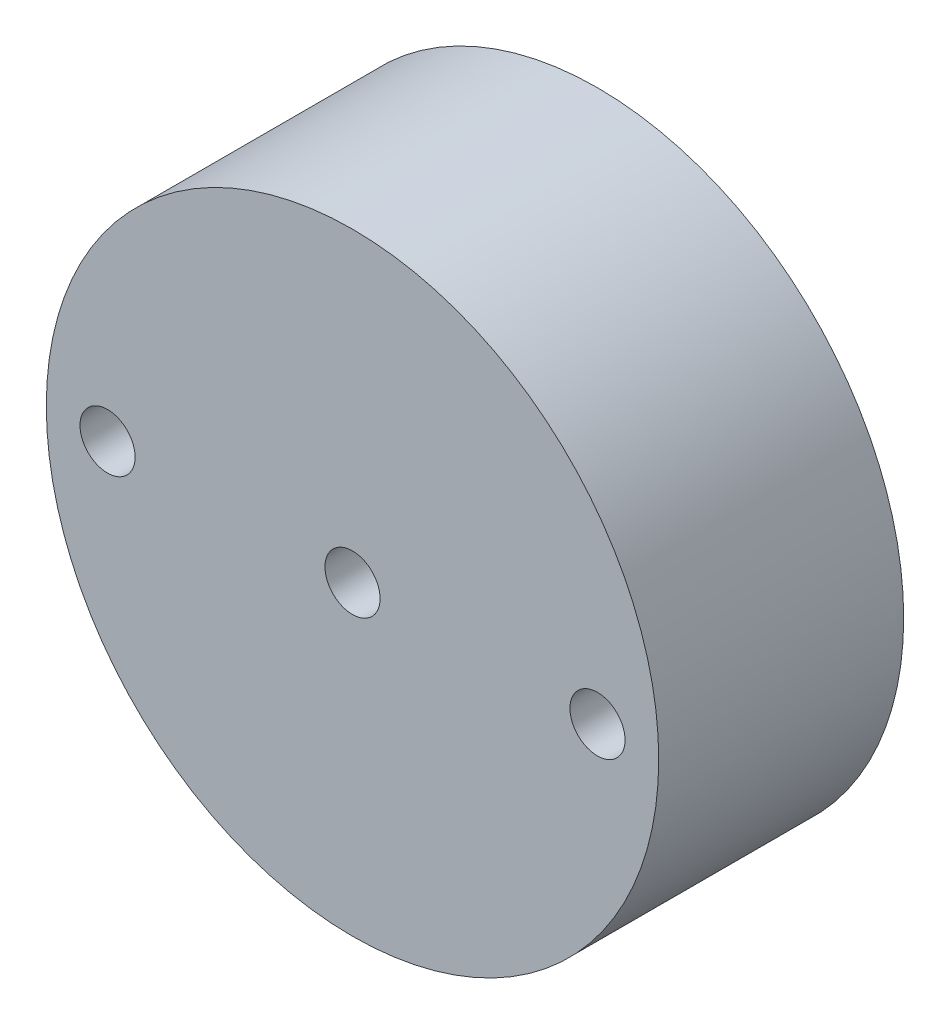
ISO-10303-21;
HEADER;
FILE_DESCRIPTION(('STEP AP214'),'2;1');
FILE_NAME('part.step','',(''),(''),'','','');
FILE_SCHEMA(('AUTOMOTIVE_DESIGN { 1 0 10303 214 1 1 1 1 }'));
ENDSEC;
DATA;
#1=APPLICATION_CONTEXT('core data for automotive mechanical design processes');
#2=APPLICATION_PROTOCOL_DEFINITION('international standard','automotive_design',2000,#1);
#3=PRODUCT_CONTEXT('',#1,'mechanical');
#4=PRODUCT('Part','Part','',(#3));
#5=PRODUCT_RELATED_PRODUCT_CATEGORY('part','',(#4));
#6=PRODUCT_DEFINITION_FORMATION('','',#4);
#7=PRODUCT_DEFINITION_CONTEXT('part definition',#1,'design');
#8=PRODUCT_DEFINITION('design','',#6,#7);
#9=PRODUCT_DEFINITION_SHAPE('','',#8);
#10=(LENGTH_UNIT() NAMED_UNIT(*) SI_UNIT(.MILLI.,.METRE.));
#11=(NAMED_UNIT(*) PLANE_ANGLE_UNIT() SI_UNIT($,.RADIAN.));
#12=(NAMED_UNIT(*) SI_UNIT($,.STERADIAN.) SOLID_ANGLE_UNIT());
#13=UNCERTAINTY_MEASURE_WITH_UNIT(LENGTH_MEASURE(1.E-05),#10,'distance_accuracy_value','');
#14=(GEOMETRIC_REPRESENTATION_CONTEXT(3) GLOBAL_UNCERTAINTY_ASSIGNED_CONTEXT((#13)) GLOBAL_UNIT_ASSIGNED_CONTEXT((#10,
#11,#12)) REPRESENTATION_CONTEXT('',''));
#15=CARTESIAN_POINT('',(0.,0.,0.));
#16=DIRECTION('',(0.,0.,1.));
#17=DIRECTION('',(1.,0.,0.));
#18=AXIS2_PLACEMENT_3D('',#15,#16,#17);
#19=CARTESIAN_POINT('',(255.,-5.99999999999996,90.7106781186547));
#20=DIRECTION('',(0.,0.,-1.));
#21=DIRECTION('',(-1.,0.,0.));
#22=AXIS2_PLACEMENT_3D('',#19,#20,#21);
#23=CYLINDRICAL_SURFACE('',#22,2.25000000000001);
#24=CARTESIAN_POINT('',(255.,-5.99999999999996,0.));
#25=DIRECTION('',(0.,0.,1.));
#26=DIRECTION('',(1.,0.,0.));
#27=AXIS2_PLACEMENT_3D('',#24,#25,#26);
#28=CIRCLE('',#27,2.25000000000001);
#29=CARTESIAN_POINT('',(257.25,-5.99999999999996,0.));
#30=VERTEX_POINT('',#29);
#31=EDGE_CURVE('E64',#30,#30,#28,.T.);
#32=ORIENTED_EDGE('',*,*,#31,.F.);
#33=EDGE_LOOP('',(#32));
#34=FACE_BOUND('',#33,.T.);
#35=CARTESIAN_POINT('',(255.,-5.99999999999996,20.));
#36=DIRECTION('',(0.,0.,1.));
#37=DIRECTION('',(1.,0.,0.));
#38=AXIS2_PLACEMENT_3D('',#35,#36,#37);
#39=CIRCLE('',#38,2.25000000000001);
#40=CARTESIAN_POINT('',(257.25,-5.99999999999996,20.));
#41=VERTEX_POINT('',#40);
#42=EDGE_CURVE('E80',#41,#41,#39,.T.);
#43=ORIENTED_EDGE('',*,*,#42,.T.);
#44=EDGE_LOOP('',(#43));
#45=FACE_BOUND('',#44,.T.);
#46=ADVANCED_FACE('F38',(#34,#45),#23,.F.);
#47=CARTESIAN_POINT('',(215.,-5.99999999999996,90.7106781186547));
#48=DIRECTION('',(0.,0.,-1.));
#49=DIRECTION('',(-1.,0.,0.));
#50=AXIS2_PLACEMENT_3D('',#47,#48,#49);
#51=CYLINDRICAL_SURFACE('',#50,2.24999999999998);
#52=CARTESIAN_POINT('',(215.,-5.99999999999996,0.));
#53=DIRECTION('',(0.,0.,1.));
#54=DIRECTION('',(1.,0.,0.));
#55=AXIS2_PLACEMENT_3D('',#52,#53,#54);
#56=CIRCLE('',#55,2.24999999999998);
#57=CARTESIAN_POINT('',(217.25,-5.99999999999996,0.));
#58=VERTEX_POINT('',#57);
#59=EDGE_CURVE('E54',#58,#58,#56,.T.);
#60=ORIENTED_EDGE('',*,*,#59,.F.);
#61=EDGE_LOOP('',(#60));
#62=FACE_BOUND('',#61,.T.);
#63=CARTESIAN_POINT('',(215.,-5.99999999999996,20.));
#64=DIRECTION('',(0.,0.,1.));
#65=DIRECTION('',(1.,0.,0.));
#66=AXIS2_PLACEMENT_3D('',#63,#64,#65);
#67=CIRCLE('',#66,2.24999999999998);
#68=CARTESIAN_POINT('',(217.25,-5.99999999999996,20.));
#69=VERTEX_POINT('',#68);
#70=EDGE_CURVE('E58',#69,#69,#67,.T.);
#71=ORIENTED_EDGE('',*,*,#70,.T.);
#72=EDGE_LOOP('',(#71));
#73=FACE_BOUND('',#72,.T.);
#74=ADVANCED_FACE('F73',(#62,#73),#51,.F.);
#75=CARTESIAN_POINT('',(235.,-5.99999999999996,90.7106781186547));
#76=DIRECTION('',(0.,0.,-1.));
#77=DIRECTION('',(-1.,0.,0.));
#78=AXIS2_PLACEMENT_3D('',#75,#76,#77);
#79=CYLINDRICAL_SURFACE('',#78,25.);
#80=CARTESIAN_POINT('',(235.,-5.99999999999996,0.));
#81=DIRECTION('',(0.,0.,1.));
#82=DIRECTION('',(1.,0.,0.));
#83=AXIS2_PLACEMENT_3D('',#80,#81,#82);
#84=CIRCLE('',#83,25.);
#85=CARTESIAN_POINT('',(260.,-5.99999999999996,0.));
#86=VERTEX_POINT('',#85);
#87=EDGE_CURVE('E47',#86,#86,#84,.T.);
#88=ORIENTED_EDGE('',*,*,#87,.T.);
#89=EDGE_LOOP('',(#88));
#90=FACE_BOUND('',#89,.T.);
#91=CARTESIAN_POINT('',(235.,-5.99999999999996,20.));
#92=DIRECTION('',(0.,0.,1.));
#93=DIRECTION('',(1.,0.,0.));
#94=AXIS2_PLACEMENT_3D('',#91,#92,#93);
#95=CIRCLE('',#94,25.);
#96=CARTESIAN_POINT('',(260.,-5.99999999999996,20.));
#97=VERTEX_POINT('',#96);
#98=EDGE_CURVE('E11',#97,#97,#95,.T.);
#99=ORIENTED_EDGE('',*,*,#98,.F.);
#100=EDGE_LOOP('',(#99));
#101=FACE_BOUND('',#100,.T.);
#102=ADVANCED_FACE('F40',(#90,#101),#79,.T.);
#103=CARTESIAN_POINT('',(235.,-5.99999999999996,0.));
#104=DIRECTION('',(0.,0.,1.));
#105=DIRECTION('',(1.,0.,0.));
#106=AXIS2_PLACEMENT_3D('',#103,#104,#105);
#107=PLANE('',#106);
#108=ORIENTED_EDGE('',*,*,#87,.F.);
#109=EDGE_LOOP('',(#108));
#110=FACE_BOUND('',#109,.T.);
#111=ORIENTED_EDGE('',*,*,#59,.T.);
#112=EDGE_LOOP('',(#111));
#113=FACE_BOUND('',#112,.T.);
#114=ORIENTED_EDGE('',*,*,#31,.T.);
#115=EDGE_LOOP('',(#114));
#116=FACE_BOUND('',#115,.T.);
#117=CARTESIAN_POINT('',(235.,-5.99999999999996,0.));
#118=DIRECTION('',(0.,0.,1.));
#119=DIRECTION('',(1.,0.,0.));
#120=AXIS2_PLACEMENT_3D('',#117,#118,#119);
#121=CIRCLE('',#120,2.25000000000001);
#122=CARTESIAN_POINT('',(237.25,-5.99999999999996,0.));
#123=VERTEX_POINT('',#122);
#124=EDGE_CURVE('E60',#123,#123,#121,.T.);
#125=ORIENTED_EDGE('',*,*,#124,.T.);
#126=EDGE_LOOP('',(#125));
#127=FACE_BOUND('',#126,.T.);
#128=ADVANCED_FACE('F70',(#110,#113,#116,#127),#107,.F.);
#129=CARTESIAN_POINT('',(235.,-5.99999999999996,90.7106781186547));
#130=DIRECTION('',(0.,0.,-1.));
#131=DIRECTION('',(-1.,0.,0.));
#132=AXIS2_PLACEMENT_3D('',#129,#130,#131);
#133=CYLINDRICAL_SURFACE('',#132,2.25000000000001);
#134=ORIENTED_EDGE('',*,*,#124,.F.);
#135=EDGE_LOOP('',(#134));
#136=FACE_BOUND('',#135,.T.);
#137=CARTESIAN_POINT('',(235.,-5.99999999999996,20.));
#138=DIRECTION('',(0.,0.,1.));
#139=DIRECTION('',(1.,0.,0.));
#140=AXIS2_PLACEMENT_3D('',#137,#138,#139);
#141=CIRCLE('',#140,2.25000000000001);
#142=CARTESIAN_POINT('',(237.25,-5.99999999999996,20.));
#143=VERTEX_POINT('',#142);
#144=EDGE_CURVE('E42',#143,#143,#141,.T.);
#145=ORIENTED_EDGE('',*,*,#144,.T.);
#146=EDGE_LOOP('',(#145));
#147=FACE_BOUND('',#146,.T.);
#148=ADVANCED_FACE('F90',(#136,#147),#133,.F.);
#149=CARTESIAN_POINT('',(235.,-5.99999999999996,20.));
#150=DIRECTION('',(0.,0.,1.));
#151=DIRECTION('',(1.,0.,0.));
#152=AXIS2_PLACEMENT_3D('',#149,#150,#151);
#153=PLANE('',#152);
#154=ORIENTED_EDGE('',*,*,#144,.F.);
#155=EDGE_LOOP('',(#154));
#156=FACE_BOUND('',#155,.T.);
#157=ORIENTED_EDGE('',*,*,#42,.F.);
#158=EDGE_LOOP('',(#157));
#159=FACE_BOUND('',#158,.T.);
#160=ORIENTED_EDGE('',*,*,#70,.F.);
#161=EDGE_LOOP('',(#160));
#162=FACE_BOUND('',#161,.T.);
#163=ORIENTED_EDGE('',*,*,#98,.T.);
#164=EDGE_LOOP('',(#163));
#165=FACE_BOUND('',#164,.T.);
#166=ADVANCED_FACE('F92',(#156,#159,#162,#165),#153,.T.);
#167=CLOSED_SHELL('',(#46,#74,#102,#128,#148,#166));
#168=MANIFOLD_SOLID_BREP('B2',#167);
#169=ADVANCED_BREP_SHAPE_REPRESENTATION('',(#18,#168),#14);
#170=SHAPE_DEFINITION_REPRESENTATION(#9,#169);
ENDSEC;
END-ISO-10303-21;
